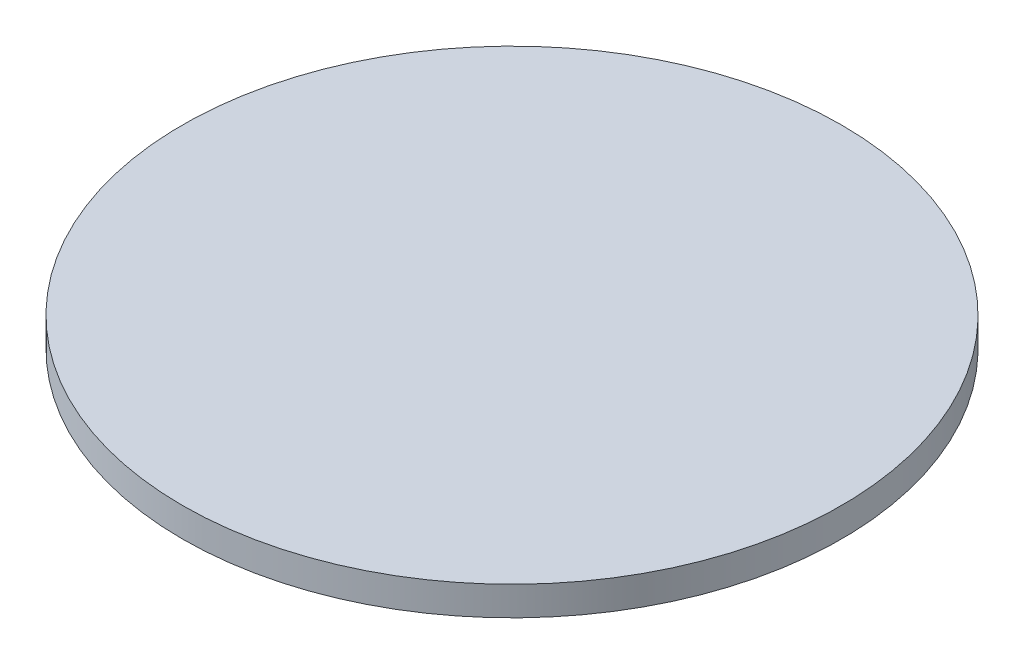
ISO-10303-21;
HEADER;
FILE_DESCRIPTION(('STEP AP214'),'2;1');
FILE_NAME('part.step','',(''),(''),'','','');
FILE_SCHEMA(('AUTOMOTIVE_DESIGN { 1 0 10303 214 1 1 1 1 }'));
ENDSEC;
DATA;
#1=APPLICATION_CONTEXT('core data for automotive mechanical design processes');
#2=APPLICATION_PROTOCOL_DEFINITION('international standard','automotive_design',2000,#1);
#3=PRODUCT_CONTEXT('',#1,'mechanical');
#4=PRODUCT('Part','Part','',(#3));
#5=PRODUCT_RELATED_PRODUCT_CATEGORY('part','',(#4));
#6=PRODUCT_DEFINITION_FORMATION('','',#4);
#7=PRODUCT_DEFINITION_CONTEXT('part definition',#1,'design');
#8=PRODUCT_DEFINITION('design','',#6,#7);
#9=PRODUCT_DEFINITION_SHAPE('','',#8);
#10=(LENGTH_UNIT() NAMED_UNIT(*) SI_UNIT(.MILLI.,.METRE.));
#11=(NAMED_UNIT(*) PLANE_ANGLE_UNIT() SI_UNIT($,.RADIAN.));
#12=(NAMED_UNIT(*) SI_UNIT($,.STERADIAN.) SOLID_ANGLE_UNIT());
#13=UNCERTAINTY_MEASURE_WITH_UNIT(LENGTH_MEASURE(1.E-05),#10,'distance_accuracy_value','');
#14=(GEOMETRIC_REPRESENTATION_CONTEXT(3) GLOBAL_UNCERTAINTY_ASSIGNED_CONTEXT((#13)) GLOBAL_UNIT_ASSIGNED_CONTEXT((#10,
#11,#12)) REPRESENTATION_CONTEXT('',''));
#15=CARTESIAN_POINT('',(0.,0.,0.));
#16=DIRECTION('',(0.,0.,1.));
#17=DIRECTION('',(1.,0.,0.));
#18=AXIS2_PLACEMENT_3D('',#15,#16,#17);
#19=CARTESIAN_POINT('',(0.,0.560547,0.));
#20=DIRECTION('',(0.,-1.,0.));
#21=DIRECTION('',(0.,0.,-1.));
#22=AXIS2_PLACEMENT_3D('',#19,#20,#21);
#23=CYLINDRICAL_SURFACE('',#22,6.35);
#24=CARTESIAN_POINT('',(0.,0.560547,0.));
#25=DIRECTION('',(0.,1.,0.));
#26=DIRECTION('',(0.,0.,1.));
#27=AXIS2_PLACEMENT_3D('',#24,#25,#26);
#28=CIRCLE('',#27,6.35);
#29=CARTESIAN_POINT('',(0.,0.560547,6.35));
#30=VERTEX_POINT('',#29);
#31=EDGE_CURVE('E10',#30,#30,#28,.T.);
#32=ORIENTED_EDGE('',*,*,#31,.F.);
#33=EDGE_LOOP('',(#32));
#34=FACE_BOUND('',#33,.T.);
#35=CARTESIAN_POINT('',(0.,0.,0.));
#36=DIRECTION('',(0.,1.,0.));
#37=DIRECTION('',(0.,0.,1.));
#38=AXIS2_PLACEMENT_3D('',#35,#36,#37);
#39=CIRCLE('',#38,6.35);
#40=CARTESIAN_POINT('',(0.,0.,6.35));
#41=VERTEX_POINT('',#40);
#42=EDGE_CURVE('E40',#41,#41,#39,.T.);
#43=ORIENTED_EDGE('',*,*,#42,.T.);
#44=EDGE_LOOP('',(#43));
#45=FACE_BOUND('',#44,.T.);
#46=ADVANCED_FACE('F37',(#34,#45),#23,.T.);
#47=CARTESIAN_POINT('',(0.,0.560547,0.));
#48=DIRECTION('',(0.,1.,0.));
#49=DIRECTION('',(0.,0.,1.));
#50=AXIS2_PLACEMENT_3D('',#47,#48,#49);
#51=PLANE('',#50);
#52=ORIENTED_EDGE('',*,*,#31,.T.);
#53=EDGE_LOOP('',(#52));
#54=FACE_BOUND('',#53,.T.);
#55=ADVANCED_FACE('F54',(#54),#51,.T.);
#56=CARTESIAN_POINT('',(0.,0.,0.));
#57=DIRECTION('',(0.,1.,0.));
#58=DIRECTION('',(0.,0.,1.));
#59=AXIS2_PLACEMENT_3D('',#56,#57,#58);
#60=PLANE('',#59);
#61=ORIENTED_EDGE('',*,*,#42,.F.);
#62=EDGE_LOOP('',(#61));
#63=FACE_BOUND('',#62,.T.);
#64=ADVANCED_FACE('F52',(#63),#60,.F.);
#65=CLOSED_SHELL('',(#46,#55,#64));
#66=MANIFOLD_SOLID_BREP('B2',#65);
#67=ADVANCED_BREP_SHAPE_REPRESENTATION('',(#18,#66),#14);
#68=SHAPE_DEFINITION_REPRESENTATION(#9,#67);
ENDSEC;
END-ISO-10303-21;
